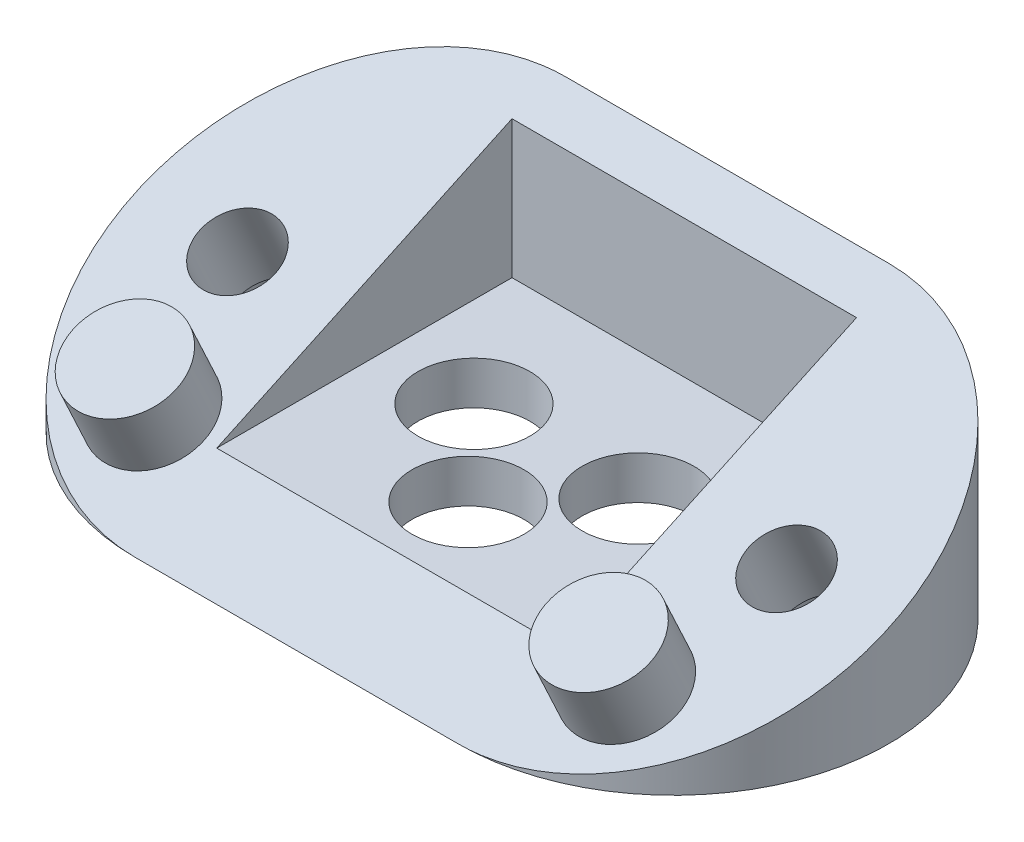
ISO-10303-21;
HEADER;
FILE_DESCRIPTION(('STEP AP214'),'2;1');
FILE_NAME('part.step','',(''),(''),'','','');
FILE_SCHEMA(('AUTOMOTIVE_DESIGN { 1 0 10303 214 1 1 1 1 }'));
ENDSEC;
DATA;
#1=APPLICATION_CONTEXT('core data for automotive mechanical design processes');
#2=APPLICATION_PROTOCOL_DEFINITION('international standard','automotive_design',2000,#1);
#3=PRODUCT_CONTEXT('',#1,'mechanical');
#4=PRODUCT('Part','Part','',(#3));
#5=PRODUCT_RELATED_PRODUCT_CATEGORY('part','',(#4));
#6=PRODUCT_DEFINITION_FORMATION('','',#4);
#7=PRODUCT_DEFINITION_CONTEXT('part definition',#1,'design');
#8=PRODUCT_DEFINITION('design','',#6,#7);
#9=PRODUCT_DEFINITION_SHAPE('','',#8);
#10=(LENGTH_UNIT() NAMED_UNIT(*) SI_UNIT(.MILLI.,.METRE.));
#11=(NAMED_UNIT(*) PLANE_ANGLE_UNIT() SI_UNIT($,.RADIAN.));
#12=(NAMED_UNIT(*) SI_UNIT($,.STERADIAN.) SOLID_ANGLE_UNIT());
#13=UNCERTAINTY_MEASURE_WITH_UNIT(LENGTH_MEASURE(1.E-05),#10,'distance_accuracy_value','');
#14=(GEOMETRIC_REPRESENTATION_CONTEXT(3) GLOBAL_UNCERTAINTY_ASSIGNED_CONTEXT((#13)) GLOBAL_UNIT_ASSIGNED_CONTEXT((#10,
#11,#12)) REPRESENTATION_CONTEXT('',''));
#15=CARTESIAN_POINT('',(0.,0.,0.));
#16=DIRECTION('',(0.,0.,1.));
#17=DIRECTION('',(1.,0.,0.));
#18=AXIS2_PLACEMENT_3D('',#15,#16,#17);
#19=CARTESIAN_POINT('',(-7.5,0.,0.));
#20=DIRECTION('',(0.,1.,0.));
#21=DIRECTION('',(0.,0.,1.));
#22=AXIS2_PLACEMENT_3D('',#19,#20,#21);
#23=PLANE('',#22);
#24=CARTESIAN_POINT('',(0.,0.,2.04286239259701));
#25=DIRECTION('',(0.,1.,0.));
#26=DIRECTION('',(0.,0.,1.));
#27=AXIS2_PLACEMENT_3D('',#24,#25,#26);
#28=CIRCLE('',#27,2.6);
#29=CARTESIAN_POINT('',(0.,0.,4.64286239259701));
#30=VERTEX_POINT('',#29);
#31=EDGE_CURVE('E184',#30,#30,#28,.T.);
#32=ORIENTED_EDGE('',*,*,#31,.T.);
#33=EDGE_LOOP('',(#32));
#34=FACE_BOUND('',#33,.T.);
#35=CARTESIAN_POINT('',(3.80999999999998,0.,-2.04286239259701));
#36=DIRECTION('',(0.,1.,0.));
#37=DIRECTION('',(0.,0.,1.));
#38=AXIS2_PLACEMENT_3D('',#35,#36,#37);
#39=CIRCLE('',#38,2.6);
#40=CARTESIAN_POINT('',(3.80999999999998,0.,0.557137607402988));
#41=VERTEX_POINT('',#40);
#42=EDGE_CURVE('E187',#41,#41,#39,.T.);
#43=ORIENTED_EDGE('',*,*,#42,.T.);
#44=EDGE_LOOP('',(#43));
#45=FACE_BOUND('',#44,.T.);
#46=CARTESIAN_POINT('',(-3.81000000000002,0.,-2.04286239259701));
#47=DIRECTION('',(0.,1.,0.));
#48=DIRECTION('',(0.,0.,1.));
#49=AXIS2_PLACEMENT_3D('',#46,#47,#48);
#50=CIRCLE('',#49,2.6);
#51=CARTESIAN_POINT('',(-3.81000000000002,0.,0.557137607402986));
#52=VERTEX_POINT('',#51);
#53=EDGE_CURVE('E190',#52,#52,#50,.T.);
#54=ORIENTED_EDGE('',*,*,#53,.T.);
#55=EDGE_LOOP('',(#54));
#56=FACE_BOUND('',#55,.T.);
#57=CARTESIAN_POINT('',(-7.5,0.,0.));
#58=DIRECTION('',(0.,1.,0.));
#59=DIRECTION('',(0.,0.,1.));
#60=AXIS2_PLACEMENT_3D('',#57,#58,#59);
#61=CIRCLE('',#60,10.);
#62=CARTESIAN_POINT('',(-7.5,0.,-10.));
#63=VERTEX_POINT('',#62);
#64=CARTESIAN_POINT('',(-7.5,0.,10.));
#65=VERTEX_POINT('',#64);
#66=EDGE_CURVE('E193',#63,#65,#61,.T.);
#67=ORIENTED_EDGE('',*,*,#66,.F.);
#68=DIRECTION('',(-1.,0.,0.));
#69=VECTOR('',#68,1.);
#70=CARTESIAN_POINT('',(-7.5,0.,-10.));
#71=LINE('',#70,#69);
#72=CARTESIAN_POINT('',(7.5,0.,-10.));
#73=VERTEX_POINT('',#72);
#74=EDGE_CURVE('E201',#73,#63,#71,.T.);
#75=ORIENTED_EDGE('',*,*,#74,.F.);
#76=CARTESIAN_POINT('',(7.5,0.,0.));
#77=DIRECTION('',(0.,1.,0.));
#78=DIRECTION('',(0.,0.,1.));
#79=AXIS2_PLACEMENT_3D('',#76,#77,#78);
#80=CIRCLE('',#79,10.);
#81=CARTESIAN_POINT('',(7.5,0.,10.));
#82=VERTEX_POINT('',#81);
#83=EDGE_CURVE('E198',#82,#73,#80,.T.);
#84=ORIENTED_EDGE('',*,*,#83,.F.);
#85=DIRECTION('',(1.,0.,0.));
#86=VECTOR('',#85,1.);
#87=CARTESIAN_POINT('',(-7.5,0.,10.));
#88=LINE('',#87,#86);
#89=EDGE_CURVE('E196',#65,#82,#88,.T.);
#90=ORIENTED_EDGE('',*,*,#89,.F.);
#91=EDGE_LOOP('',(#67,#75,#84,#90));
#92=FACE_BOUND('',#91,.T.);
#93=CARTESIAN_POINT('',(-12.75,0.,-2.17442832054005));
#94=DIRECTION('',(0.,1.,0.));
#95=DIRECTION('',(0.,0.,1.));
#96=AXIS2_PLACEMENT_3D('',#93,#94,#95);
#97=ELLIPSE('',#96,2.75844479740624,2.5);
#98=CARTESIAN_POINT('',(-13.2182782644806,0.,0.535193667390117));
#99=VERTEX_POINT('',#98);
#100=CARTESIAN_POINT('',(-12.2817217355194,0.,0.535193667390117));
#101=VERTEX_POINT('',#100);
#102=EDGE_CURVE('E144',#99,#101,#97,.T.);
#103=ORIENTED_EDGE('',*,*,#102,.T.);
#104=CARTESIAN_POINT('',(-12.75,0.,-2.17442832054005));
#105=DIRECTION('',(0.,1.,0.));
#106=DIRECTION('',(0.,0.,1.));
#107=AXIS2_PLACEMENT_3D('',#104,#105,#106);
#108=ELLIPSE('',#107,2.75844479740624,2.5);
#109=EDGE_CURVE('E247',#99,#101,#108,.F.);
#110=ORIENTED_EDGE('',*,*,#109,.F.);
#111=EDGE_LOOP('',(#103,#110));
#112=FACE_BOUND('',#111,.T.);
#113=CARTESIAN_POINT('',(12.75,0.,-2.17442832054005));
#114=DIRECTION('',(0.,1.,0.));
#115=DIRECTION('',(0.,0.,1.));
#116=AXIS2_PLACEMENT_3D('',#113,#114,#115);
#117=ELLIPSE('',#116,2.75844479740624,2.5);
#118=CARTESIAN_POINT('',(13.2182782644807,0.,0.535193667390115));
#119=VERTEX_POINT('',#118);
#120=CARTESIAN_POINT('',(12.2817217355193,0.,0.535193667390115));
#121=VERTEX_POINT('',#120);
#122=EDGE_CURVE('E124',#119,#121,#117,.T.);
#123=ORIENTED_EDGE('',*,*,#122,.T.);
#124=CARTESIAN_POINT('',(12.75,0.,-2.17442832054005));
#125=DIRECTION('',(0.,1.,0.));
#126=DIRECTION('',(0.,0.,1.));
#127=AXIS2_PLACEMENT_3D('',#124,#125,#126);
#128=ELLIPSE('',#127,2.75844479740624,2.5);
#129=EDGE_CURVE('E133',#121,#119,#128,.T.);
#130=ORIENTED_EDGE('',*,*,#129,.T.);
#131=EDGE_LOOP('',(#123,#130));
#132=FACE_BOUND('',#131,.T.);
#133=ADVANCED_FACE('F56',(#34,#45,#56,#92,#112,#132),#23,.F.);
#134=CARTESIAN_POINT('',(12.75,-2.9973678496398,-3.57212390313469));
#135=DIRECTION('',(0.,0.906307787036648,0.422618261740704));
#136=DIRECTION('',(0.,-0.422618261740704,0.906307787036648));
#137=AXIS2_PLACEMENT_3D('',#134,#135,#136);
#138=CYLINDRICAL_SURFACE('',#137,1.75);
#139=CARTESIAN_POINT('',(12.75,4.66307658155005,0.));
#140=DIRECTION('',(0.,-0.906307787036648,-0.422618261740704));
#141=DIRECTION('',(0.,0.422618261740704,-0.906307787036648));
#142=AXIS2_PLACEMENT_3D('',#139,#140,#141);
#143=CIRCLE('',#142,1.75);
#144=CARTESIAN_POINT('',(12.75,5.40265853959628,-1.58603862731413));
#145=VERTEX_POINT('',#144);
#146=EDGE_CURVE('E150',#145,#145,#143,.T.);
#147=ORIENTED_EDGE('',*,*,#146,.F.);
#148=EDGE_LOOP('',(#147));
#149=FACE_BOUND('',#148,.T.);
#150=CARTESIAN_POINT('',(12.75,1.03784543340346,-1.69047304696282));
#151=DIRECTION('',(0.,0.906307787036648,0.422618261740704));
#152=DIRECTION('',(0.,-0.422618261740704,0.906307787036648));
#153=AXIS2_PLACEMENT_3D('',#150,#151,#152);
#154=CIRCLE('',#153,1.75);
#155=CARTESIAN_POINT('',(12.75,0.298263475357228,-0.104434419648684));
#156=VERTEX_POINT('',#155);
#157=EDGE_CURVE('E128',#156,#156,#154,.T.);
#158=ORIENTED_EDGE('',*,*,#157,.F.);
#159=EDGE_LOOP('',(#158));
#160=FACE_BOUND('',#159,.T.);
#161=ADVANCED_FACE('F233',(#149,#160),#138,.F.);
#162=CARTESIAN_POINT('',(-3.81000000000002,20.,-2.04286239259701));
#163=DIRECTION('',(0.,-1.,0.));
#164=DIRECTION('',(0.,0.,-1.));
#165=AXIS2_PLACEMENT_3D('',#162,#163,#164);
#166=CYLINDRICAL_SURFACE('',#165,2.6);
#167=ORIENTED_EDGE('',*,*,#53,.F.);
#168=EDGE_LOOP('',(#167));
#169=FACE_BOUND('',#168,.T.);
#170=CARTESIAN_POINT('',(-3.81000000000002,2.,-2.04286239259701));
#171=DIRECTION('',(0.,1.,0.));
#172=DIRECTION('',(0.,0.,1.));
#173=AXIS2_PLACEMENT_3D('',#170,#171,#172);
#174=CIRCLE('',#173,2.6);
#175=CARTESIAN_POINT('',(-3.81000000000002,2.,0.557137607402986));
#176=VERTEX_POINT('',#175);
#177=EDGE_CURVE('E181',#176,#176,#174,.T.);
#178=ORIENTED_EDGE('',*,*,#177,.T.);
#179=EDGE_LOOP('',(#178));
#180=FACE_BOUND('',#179,.T.);
#181=ADVANCED_FACE('F236',(#169,#180),#166,.F.);
#182=CARTESIAN_POINT('',(3.80999999999998,20.,-2.04286239259701));
#183=DIRECTION('',(0.,-1.,0.));
#184=DIRECTION('',(0.,0.,-1.));
#185=AXIS2_PLACEMENT_3D('',#182,#183,#184);
#186=CYLINDRICAL_SURFACE('',#185,2.6);
#187=ORIENTED_EDGE('',*,*,#42,.F.);
#188=EDGE_LOOP('',(#187));
#189=FACE_BOUND('',#188,.T.);
#190=CARTESIAN_POINT('',(3.80999999999998,2.,-2.04286239259701));
#191=DIRECTION('',(0.,1.,0.));
#192=DIRECTION('',(0.,0.,1.));
#193=AXIS2_PLACEMENT_3D('',#190,#191,#192);
#194=CIRCLE('',#193,2.6);
#195=CARTESIAN_POINT('',(3.80999999999998,2.,0.557137607402988));
#196=VERTEX_POINT('',#195);
#197=EDGE_CURVE('E178',#196,#196,#194,.T.);
#198=ORIENTED_EDGE('',*,*,#197,.T.);
#199=EDGE_LOOP('',(#198));
#200=FACE_BOUND('',#199,.T.);
#201=ADVANCED_FACE('F345',(#189,#200),#186,.F.);
#202=CARTESIAN_POINT('',(0.,20.,2.04286239259701));
#203=DIRECTION('',(0.,-1.,0.));
#204=DIRECTION('',(0.,0.,-1.));
#205=AXIS2_PLACEMENT_3D('',#202,#203,#204);
#206=CYLINDRICAL_SURFACE('',#205,2.6);
#207=ORIENTED_EDGE('',*,*,#31,.F.);
#208=EDGE_LOOP('',(#207));
#209=FACE_BOUND('',#208,.T.);
#210=CARTESIAN_POINT('',(0.,2.,2.04286239259701));
#211=DIRECTION('',(0.,1.,0.));
#212=DIRECTION('',(0.,0.,1.));
#213=AXIS2_PLACEMENT_3D('',#210,#211,#212);
#214=CIRCLE('',#213,2.6);
#215=CARTESIAN_POINT('',(0.,2.,4.64286239259701));
#216=VERTEX_POINT('',#215);
#217=EDGE_CURVE('E177',#216,#216,#214,.T.);
#218=ORIENTED_EDGE('',*,*,#217,.T.);
#219=EDGE_LOOP('',(#218));
#220=FACE_BOUND('',#219,.T.);
#221=ADVANCED_FACE('F294',(#209,#220),#206,.F.);
#222=CARTESIAN_POINT('',(-7.5,20.,0.));
#223=DIRECTION('',(0.,-1.,0.));
#224=DIRECTION('',(0.,0.,-1.));
#225=AXIS2_PLACEMENT_3D('',#222,#223,#224);
#226=CYLINDRICAL_SURFACE('',#225,10.);
#227=ORIENTED_EDGE('',*,*,#66,.T.);
#228=CARTESIAN_POINT('',(-7.5,4.66307658155005,0.));
#229=DIRECTION('',(0.,-0.906307787036648,-0.422618261740704));
#230=DIRECTION('',(0.,-0.422618261740704,0.906307787036648));
#231=AXIS2_PLACEMENT_3D('',#228,#229,#230);
#232=ELLIPSE('',#231,11.0337791896249,10.);
#233=CARTESIAN_POINT('',(-7.5,9.3261531631001,-10.));
#234=VERTEX_POINT('',#233);
#235=EDGE_CURVE('E162',#65,#234,#232,.T.);
#236=ORIENTED_EDGE('',*,*,#235,.T.);
#237=DIRECTION('',(0.,-1.,0.));
#238=VECTOR('',#237,1.);
#239=CARTESIAN_POINT('',(-7.5,20.,-10.));
#240=LINE('',#239,#238);
#241=EDGE_CURVE('E204',#234,#63,#240,.T.);
#242=ORIENTED_EDGE('',*,*,#241,.T.);
#243=EDGE_LOOP('',(#227,#236,#242));
#244=FACE_BOUND('',#243,.T.);
#245=ADVANCED_FACE('F58',(#244),#226,.T.);
#246=CARTESIAN_POINT('',(7.5,20.,0.));
#247=DIRECTION('',(0.,-1.,0.));
#248=DIRECTION('',(0.,0.,-1.));
#249=AXIS2_PLACEMENT_3D('',#246,#247,#248);
#250=CYLINDRICAL_SURFACE('',#249,10.);
#251=DIRECTION('',(0.,-1.,0.));
#252=VECTOR('',#251,1.);
#253=CARTESIAN_POINT('',(7.5,20.,-10.));
#254=LINE('',#253,#252);
#255=CARTESIAN_POINT('',(7.5,9.3261531631001,-10.));
#256=VERTEX_POINT('',#255);
#257=EDGE_CURVE('E206',#256,#73,#254,.T.);
#258=ORIENTED_EDGE('',*,*,#257,.F.);
#259=CARTESIAN_POINT('',(7.5,4.66307658155005,0.));
#260=DIRECTION('',(0.,-0.906307787036648,-0.422618261740704));
#261=DIRECTION('',(0.,-0.422618261740704,0.906307787036648));
#262=AXIS2_PLACEMENT_3D('',#259,#260,#261);
#263=ELLIPSE('',#262,11.0337791896249,10.);
#264=EDGE_CURVE('E71',#256,#82,#263,.T.);
#265=ORIENTED_EDGE('',*,*,#264,.T.);
#266=ORIENTED_EDGE('',*,*,#83,.T.);
#267=EDGE_LOOP('',(#258,#265,#266));
#268=FACE_BOUND('',#267,.T.);
#269=ADVANCED_FACE('F287',(#268),#250,.T.);
#270=CARTESIAN_POINT('',(-7.5,20.,-10.));
#271=DIRECTION('',(0.,0.,1.));
#272=DIRECTION('',(1.,0.,0.));
#273=AXIS2_PLACEMENT_3D('',#270,#271,#272);
#274=PLANE('',#273);
#275=ORIENTED_EDGE('',*,*,#241,.F.);
#276=DIRECTION('',(1.,0.,0.));
#277=VECTOR('',#276,1.);
#278=CARTESIAN_POINT('',(-17.5,9.3261531631001,-10.));
#279=LINE('',#278,#277);
#280=EDGE_CURVE('E151',#234,#256,#279,.T.);
#281=ORIENTED_EDGE('',*,*,#280,.T.);
#282=ORIENTED_EDGE('',*,*,#257,.T.);
#283=ORIENTED_EDGE('',*,*,#74,.T.);
#284=EDGE_LOOP('',(#275,#281,#282,#283));
#285=FACE_BOUND('',#284,.T.);
#286=ADVANCED_FACE('F284',(#285),#274,.F.);
#287=CARTESIAN_POINT('',(8.,-22.6274169979695,-8.));
#288=DIRECTION('',(1.,0.,0.));
#289=DIRECTION('',(0.,0.,-1.));
#290=AXIS2_PLACEMENT_3D('',#287,#288,#289);
#291=PLANE('',#290);
#292=DIRECTION('',(0.,0.,1.));
#293=VECTOR('',#292,1.);
#294=CARTESIAN_POINT('',(8.,2.,-8.));
#295=LINE('',#294,#293);
#296=CARTESIAN_POINT('',(8.,2.,-8.));
#297=VERTEX_POINT('',#296);
#298=CARTESIAN_POINT('',(8.,2.,5.71098615898094));
#299=VERTEX_POINT('',#298);
#300=EDGE_CURVE('E167',#297,#299,#295,.T.);
#301=ORIENTED_EDGE('',*,*,#300,.T.);
#302=DIRECTION('',(0.,0.422618261740704,-0.906307787036648));
#303=VECTOR('',#302,1.);
#304=CARTESIAN_POINT('',(8.,2.85300313183871,3.88171503953652));
#305=LINE('',#304,#303);
#306=CARTESIAN_POINT('',(8.,8.39353784679009,-8.));
#307=VERTEX_POINT('',#306);
#308=EDGE_CURVE('E79',#299,#307,#305,.T.);
#309=ORIENTED_EDGE('',*,*,#308,.T.);
#310=DIRECTION('',(0.,1.,0.));
#311=VECTOR('',#310,1.);
#312=CARTESIAN_POINT('',(8.,-22.6274169979695,-8.));
#313=LINE('',#312,#311);
#314=EDGE_CURVE('E164',#297,#307,#313,.T.);
#315=ORIENTED_EDGE('',*,*,#314,.F.);
#316=EDGE_LOOP('',(#301,#309,#315));
#317=FACE_BOUND('',#316,.T.);
#318=ADVANCED_FACE('F286',(#317),#291,.F.);
#319=CARTESIAN_POINT('',(-8.,-22.6274169979695,-8.));
#320=DIRECTION('',(-1.,0.,0.));
#321=DIRECTION('',(0.,0.,1.));
#322=AXIS2_PLACEMENT_3D('',#319,#320,#321);
#323=PLANE('',#322);
#324=DIRECTION('',(0.,1.,0.));
#325=VECTOR('',#324,1.);
#326=CARTESIAN_POINT('',(-8.,-22.6274169979695,-8.));
#327=LINE('',#326,#325);
#328=CARTESIAN_POINT('',(-8.,2.,-8.));
#329=VERTEX_POINT('',#328);
#330=CARTESIAN_POINT('',(-8.,8.39353784679009,-8.));
#331=VERTEX_POINT('',#330);
#332=EDGE_CURVE('E168',#329,#331,#327,.T.);
#333=ORIENTED_EDGE('',*,*,#332,.T.);
#334=DIRECTION('',(0.,-0.422618261740704,0.906307787036648));
#335=VECTOR('',#334,1.);
#336=CARTESIAN_POINT('',(-8.,2.85300313183871,3.88171503953652));
#337=LINE('',#336,#335);
#338=CARTESIAN_POINT('',(-8.,2.,5.71098615898094));
#339=VERTEX_POINT('',#338);
#340=EDGE_CURVE('E153',#331,#339,#337,.T.);
#341=ORIENTED_EDGE('',*,*,#340,.T.);
#342=DIRECTION('',(0.,0.,-1.));
#343=VECTOR('',#342,1.);
#344=CARTESIAN_POINT('',(-8.,2.,-8.));
#345=LINE('',#344,#343);
#346=EDGE_CURVE('E165',#339,#329,#345,.T.);
#347=ORIENTED_EDGE('',*,*,#346,.T.);
#348=EDGE_LOOP('',(#333,#341,#347));
#349=FACE_BOUND('',#348,.T.);
#350=ADVANCED_FACE('F334',(#349),#323,.F.);
#351=CARTESIAN_POINT('',(-8.,-22.6274169979695,-8.));
#352=DIRECTION('',(0.,0.,-1.));
#353=DIRECTION('',(-1.,0.,0.));
#354=AXIS2_PLACEMENT_3D('',#351,#352,#353);
#355=PLANE('',#354);
#356=ORIENTED_EDGE('',*,*,#314,.T.);
#357=DIRECTION('',(-1.,0.,0.));
#358=VECTOR('',#357,1.);
#359=CARTESIAN_POINT('',(-8.,8.39353784679009,-8.));
#360=LINE('',#359,#358);
#361=EDGE_CURVE('E158',#307,#331,#360,.T.);
#362=ORIENTED_EDGE('',*,*,#361,.T.);
#363=ORIENTED_EDGE('',*,*,#332,.F.);
#364=DIRECTION('',(1.,0.,0.));
#365=VECTOR('',#364,1.);
#366=CARTESIAN_POINT('',(-8.,2.,-8.));
#367=LINE('',#366,#365);
#368=EDGE_CURVE('E171',#329,#297,#367,.T.);
#369=ORIENTED_EDGE('',*,*,#368,.T.);
#370=EDGE_LOOP('',(#356,#362,#363,#369));
#371=FACE_BOUND('',#370,.T.);
#372=ADVANCED_FACE('F332',(#371),#355,.F.);
#373=CARTESIAN_POINT('',(-7.5,2.,0.));
#374=DIRECTION('',(0.,1.,0.));
#375=DIRECTION('',(0.,0.,1.));
#376=AXIS2_PLACEMENT_3D('',#373,#374,#375);
#377=PLANE('',#376);
#378=DIRECTION('',(-1.,0.,0.));
#379=VECTOR('',#378,1.);
#380=CARTESIAN_POINT('',(-7.5,2.,5.71098615898094));
#381=LINE('',#380,#379);
#382=EDGE_CURVE('E208',#299,#339,#381,.T.);
#383=ORIENTED_EDGE('',*,*,#382,.F.);
#384=ORIENTED_EDGE('',*,*,#300,.F.);
#385=ORIENTED_EDGE('',*,*,#368,.F.);
#386=ORIENTED_EDGE('',*,*,#346,.F.);
#387=EDGE_LOOP('',(#383,#384,#385,#386));
#388=FACE_BOUND('',#387,.T.);
#389=ORIENTED_EDGE('',*,*,#177,.F.);
#390=EDGE_LOOP('',(#389));
#391=FACE_BOUND('',#390,.T.);
#392=ORIENTED_EDGE('',*,*,#197,.F.);
#393=EDGE_LOOP('',(#392));
#394=FACE_BOUND('',#393,.T.);
#395=ORIENTED_EDGE('',*,*,#217,.F.);
#396=EDGE_LOOP('',(#395));
#397=FACE_BOUND('',#396,.T.);
#398=ADVANCED_FACE('F223',(#388,#391,#394,#397),#377,.T.);
#399=CARTESIAN_POINT('',(-17.5,3.83022221559492,1.78606195156734));
#400=DIRECTION('',(0.,-0.906307787036648,-0.422618261740704));
#401=DIRECTION('',(0.,0.422618261740704,-0.906307787036648));
#402=AXIS2_PLACEMENT_3D('',#399,#400,#401);
#403=PLANE('',#402);
#404=CARTESIAN_POINT('',(11.,2.,5.71098615898094));
#405=DIRECTION('',(0.,-0.906307787036648,-0.422618261740704));
#406=DIRECTION('',(0.,0.422618261740704,-0.906307787036648));
#407=AXIS2_PLACEMENT_3D('',#404,#405,#406);
#408=CIRCLE('',#407,2.4);
#409=CARTESIAN_POINT('',(11.,3.01428382817769,3.53584747009299));
#410=VERTEX_POINT('',#409);
#411=EDGE_CURVE('E13',#410,#410,#408,.F.);
#412=ORIENTED_EDGE('',*,*,#411,.F.);
#413=EDGE_LOOP('',(#412));
#414=FACE_BOUND('',#413,.T.);
#415=CARTESIAN_POINT('',(-11.,2.,5.71098615898094));
#416=DIRECTION('',(0.,-0.906307787036648,-0.422618261740704));
#417=DIRECTION('',(0.,0.422618261740704,-0.906307787036648));
#418=AXIS2_PLACEMENT_3D('',#415,#416,#417);
#419=CIRCLE('',#418,2.4);
#420=CARTESIAN_POINT('',(-11.,3.01428382817769,3.53584747009299));
#421=VERTEX_POINT('',#420);
#422=EDGE_CURVE('E64',#421,#421,#419,.F.);
#423=ORIENTED_EDGE('',*,*,#422,.F.);
#424=EDGE_LOOP('',(#423));
#425=FACE_BOUND('',#424,.T.);
#426=ORIENTED_EDGE('',*,*,#308,.F.);
#427=ORIENTED_EDGE('',*,*,#382,.T.);
#428=ORIENTED_EDGE('',*,*,#340,.F.);
#429=ORIENTED_EDGE('',*,*,#361,.F.);
#430=EDGE_LOOP('',(#426,#427,#428,#429));
#431=FACE_BOUND('',#430,.T.);
#432=ORIENTED_EDGE('',*,*,#89,.T.);
#433=ORIENTED_EDGE('',*,*,#264,.F.);
#434=ORIENTED_EDGE('',*,*,#280,.F.);
#435=ORIENTED_EDGE('',*,*,#235,.F.);
#436=EDGE_LOOP('',(#432,#433,#434,#435));
#437=FACE_BOUND('',#436,.T.);
#438=CARTESIAN_POINT('',(-12.75,4.66307658155005,0.));
#439=DIRECTION('',(0.,-0.906307787036648,-0.422618261740704));
#440=DIRECTION('',(0.,0.422618261740704,-0.906307787036648));
#441=AXIS2_PLACEMENT_3D('',#438,#439,#440);
#442=CIRCLE('',#441,1.75);
#443=CARTESIAN_POINT('',(-12.75,5.40265853959628,-1.58603862731413));
#444=VERTEX_POINT('',#443);
#445=EDGE_CURVE('E154',#444,#444,#442,.T.);
#446=ORIENTED_EDGE('',*,*,#445,.T.);
#447=EDGE_LOOP('',(#446));
#448=FACE_BOUND('',#447,.T.);
#449=ORIENTED_EDGE('',*,*,#146,.T.);
#450=EDGE_LOOP('',(#449));
#451=FACE_BOUND('',#450,.T.);
#452=ADVANCED_FACE('F220',(#414,#425,#431,#437,#448,#451),#403,.F.);
#453=CARTESIAN_POINT('',(-12.75,-2.9973678496398,-3.57212390313469));
#454=DIRECTION('',(0.,0.906307787036648,0.422618261740704));
#455=DIRECTION('',(0.,-0.422618261740704,0.906307787036648));
#456=AXIS2_PLACEMENT_3D('',#453,#454,#455);
#457=CYLINDRICAL_SURFACE('',#456,1.75);
#458=CARTESIAN_POINT('',(-12.75,1.03784543340346,-1.69047304696282));
#459=DIRECTION('',(0.,0.906307787036648,0.422618261740704));
#460=DIRECTION('',(0.,-0.422618261740704,0.906307787036648));
#461=AXIS2_PLACEMENT_3D('',#458,#459,#460);
#462=CIRCLE('',#461,1.75);
#463=CARTESIAN_POINT('',(-12.75,0.298263475357228,-0.104434419648682));
#464=VERTEX_POINT('',#463);
#465=EDGE_CURVE('E240',#464,#464,#462,.T.);
#466=ORIENTED_EDGE('',*,*,#465,.F.);
#467=EDGE_LOOP('',(#466));
#468=FACE_BOUND('',#467,.T.);
#469=ORIENTED_EDGE('',*,*,#445,.F.);
#470=EDGE_LOOP('',(#469));
#471=FACE_BOUND('',#470,.T.);
#472=ADVANCED_FACE('F222',(#468,#471),#457,.F.);
#473=CARTESIAN_POINT('',(-12.75,1.03784543340346,-1.69047304696282));
#474=DIRECTION('',(0.,0.906307787036648,0.422618261740704));
#475=DIRECTION('',(0.,-0.422618261740704,0.906307787036648));
#476=AXIS2_PLACEMENT_3D('',#473,#474,#475);
#477=CYLINDRICAL_SURFACE('',#476,2.5);
#478=ORIENTED_EDGE('',*,*,#102,.F.);
#479=CARTESIAN_POINT('',(-12.75,1.03784543340346,-1.69047304696282));
#480=DIRECTION('',(0.,0.906307787036648,0.422618261740704));
#481=DIRECTION('',(0.,-0.422618261740704,0.906307787036648));
#482=AXIS2_PLACEMENT_3D('',#479,#480,#481);
#483=CIRCLE('',#482,2.5);
#484=EDGE_CURVE('E141',#99,#101,#483,.T.);
#485=ORIENTED_EDGE('',*,*,#484,.T.);
#486=EDGE_LOOP('',(#478,#485));
#487=FACE_BOUND('',#486,.T.);
#488=ADVANCED_FACE('F305',(#487),#477,.T.);
#489=CARTESIAN_POINT('',(-12.75,1.03784543340346,-1.69047304696282));
#490=DIRECTION('',(0.,0.906307787036648,0.422618261740704));
#491=DIRECTION('',(0.,-0.422618261740704,0.906307787036648));
#492=AXIS2_PLACEMENT_3D('',#489,#490,#491);
#493=PLANE('',#492);
#494=ORIENTED_EDGE('',*,*,#484,.F.);
#495=CARTESIAN_POINT('',(-12.75,1.03784543340346,-1.69047304696282));
#496=DIRECTION('',(0.,0.906307787036648,0.422618261740704));
#497=DIRECTION('',(0.,-0.422618261740704,0.906307787036648));
#498=AXIS2_PLACEMENT_3D('',#495,#496,#497);
#499=CIRCLE('',#498,2.5);
#500=EDGE_CURVE('E243',#101,#99,#499,.T.);
#501=ORIENTED_EDGE('',*,*,#500,.F.);
#502=EDGE_LOOP('',(#494,#501));
#503=FACE_BOUND('',#502,.T.);
#504=ORIENTED_EDGE('',*,*,#465,.T.);
#505=EDGE_LOOP('',(#504));
#506=FACE_BOUND('',#505,.T.);
#507=ADVANCED_FACE('F307',(#503,#506),#493,.F.);
#508=CARTESIAN_POINT('',(12.75,1.03784543340346,-1.69047304696282));
#509=DIRECTION('',(0.,0.906307787036648,0.422618261740704));
#510=DIRECTION('',(0.,-0.422618261740704,0.906307787036648));
#511=AXIS2_PLACEMENT_3D('',#508,#509,#510);
#512=CYLINDRICAL_SURFACE('',#511,2.5);
#513=ORIENTED_EDGE('',*,*,#129,.F.);
#514=CARTESIAN_POINT('',(12.75,1.03784543340346,-1.69047304696282));
#515=DIRECTION('',(0.,0.906307787036648,0.422618261740704));
#516=DIRECTION('',(0.,0.422618261740704,-0.906307787036648));
#517=AXIS2_PLACEMENT_3D('',#514,#515,#516);
#518=CIRCLE('',#517,2.5);
#519=EDGE_CURVE('E134',#121,#119,#518,.T.);
#520=ORIENTED_EDGE('',*,*,#519,.T.);
#521=EDGE_LOOP('',(#513,#520));
#522=FACE_BOUND('',#521,.T.);
#523=ADVANCED_FACE('F140',(#522),#512,.T.);
#524=CARTESIAN_POINT('',(12.75,1.03784543340346,-1.69047304696282));
#525=DIRECTION('',(0.,-0.906307787036648,-0.422618261740704));
#526=DIRECTION('',(0.,0.422618261740704,-0.906307787036648));
#527=AXIS2_PLACEMENT_3D('',#524,#525,#526);
#528=PLANE('',#527);
#529=ORIENTED_EDGE('',*,*,#519,.F.);
#530=CARTESIAN_POINT('',(12.75,1.03784543340346,-1.69047304696282));
#531=DIRECTION('',(0.,-0.906307787036648,-0.422618261740704));
#532=DIRECTION('',(0.,0.422618261740704,-0.906307787036648));
#533=AXIS2_PLACEMENT_3D('',#530,#531,#532);
#534=CIRCLE('',#533,2.5);
#535=EDGE_CURVE('E121',#121,#119,#534,.T.);
#536=ORIENTED_EDGE('',*,*,#535,.T.);
#537=EDGE_LOOP('',(#529,#536));
#538=FACE_BOUND('',#537,.T.);
#539=ORIENTED_EDGE('',*,*,#157,.T.);
#540=EDGE_LOOP('',(#539));
#541=FACE_BOUND('',#540,.T.);
#542=ADVANCED_FACE('F136',(#538,#541),#528,.T.);
#543=CARTESIAN_POINT('',(12.75,-6.73981581621168,-5.31725605019378));
#544=DIRECTION('',(0.,0.906307787036648,0.422618261740704));
#545=DIRECTION('',(0.,-0.422618261740704,0.906307787036648));
#546=AXIS2_PLACEMENT_3D('',#543,#544,#545);
#547=CYLINDRICAL_SURFACE('',#546,2.5);
#548=ORIENTED_EDGE('',*,*,#535,.F.);
#549=ORIENTED_EDGE('',*,*,#122,.F.);
#550=EDGE_LOOP('',(#548,#549));
#551=FACE_BOUND('',#550,.T.);
#552=ADVANCED_FACE('F123',(#551),#547,.F.);
#553=CARTESIAN_POINT('',(-12.75,-6.73981581621167,-5.31725605019378));
#554=DIRECTION('',(0.,0.906307787036648,0.422618261740704));
#555=DIRECTION('',(0.,-0.422618261740704,0.906307787036648));
#556=AXIS2_PLACEMENT_3D('',#553,#554,#555);
#557=CYLINDRICAL_SURFACE('',#556,2.5);
#558=ORIENTED_EDGE('',*,*,#109,.T.);
#559=ORIENTED_EDGE('',*,*,#500,.T.);
#560=EDGE_LOOP('',(#558,#559));
#561=FACE_BOUND('',#560,.T.);
#562=ADVANCED_FACE('F309',(#561),#557,.F.);
#563=CARTESIAN_POINT('',(-11.,4.71892336110995,6.97884094420306));
#564=DIRECTION('',(0.,-0.906307787036648,-0.422618261740704));
#565=DIRECTION('',(0.,0.422618261740704,-0.906307787036648));
#566=AXIS2_PLACEMENT_3D('',#563,#564,#565);
#567=CYLINDRICAL_SURFACE('',#566,2.4);
#568=CARTESIAN_POINT('',(-11.,4.71892336110995,6.97884094420306));
#569=DIRECTION('',(0.,0.906307787036648,0.422618261740704));
#570=DIRECTION('',(0.,-0.422618261740704,0.906307787036648));
#571=AXIS2_PLACEMENT_3D('',#568,#569,#570);
#572=CIRCLE('',#571,2.4);
#573=CARTESIAN_POINT('',(-11.,3.70463953293226,9.15397963309101));
#574=VERTEX_POINT('',#573);
#575=EDGE_CURVE('E249',#574,#574,#572,.T.);
#576=ORIENTED_EDGE('',*,*,#575,.F.);
#577=EDGE_LOOP('',(#576));
#578=FACE_BOUND('',#577,.T.);
#579=ORIENTED_EDGE('',*,*,#422,.T.);
#580=EDGE_LOOP('',(#579));
#581=FACE_BOUND('',#580,.T.);
#582=ADVANCED_FACE('F218',(#578,#581),#567,.T.);
#583=CARTESIAN_POINT('',(-11.,4.71892336110995,6.97884094420306));
#584=DIRECTION('',(0.,0.906307787036648,0.422618261740704));
#585=DIRECTION('',(0.,-0.422618261740704,0.906307787036648));
#586=AXIS2_PLACEMENT_3D('',#583,#584,#585);
#587=PLANE('',#586);
#588=ORIENTED_EDGE('',*,*,#575,.T.);
#589=EDGE_LOOP('',(#588));
#590=FACE_BOUND('',#589,.T.);
#591=ADVANCED_FACE('F265',(#590),#587,.T.);
#592=CARTESIAN_POINT('',(11.,4.71892336110995,6.97884094420306));
#593=DIRECTION('',(0.,-0.906307787036648,-0.422618261740704));
#594=DIRECTION('',(0.,0.422618261740704,-0.906307787036648));
#595=AXIS2_PLACEMENT_3D('',#592,#593,#594);
#596=CYLINDRICAL_SURFACE('',#595,2.4);
#597=CARTESIAN_POINT('',(11.,4.71892336110995,6.97884094420306));
#598=DIRECTION('',(0.,0.906307787036648,0.422618261740704));
#599=DIRECTION('',(0.,0.422618261740704,-0.906307787036648));
#600=AXIS2_PLACEMENT_3D('',#597,#598,#599);
#601=CIRCLE('',#600,2.4);
#602=CARTESIAN_POINT('',(11.,5.73320718928764,4.8037022553151));
#603=VERTEX_POINT('',#602);
#604=EDGE_CURVE('E253',#603,#603,#601,.T.);
#605=ORIENTED_EDGE('',*,*,#604,.F.);
#606=EDGE_LOOP('',(#605));
#607=FACE_BOUND('',#606,.T.);
#608=ORIENTED_EDGE('',*,*,#411,.T.);
#609=EDGE_LOOP('',(#608));
#610=FACE_BOUND('',#609,.T.);
#611=ADVANCED_FACE('F262',(#607,#610),#596,.T.);
#612=CARTESIAN_POINT('',(11.,4.71892336110995,6.97884094420306));
#613=DIRECTION('',(0.,-0.906307787036648,-0.422618261740704));
#614=DIRECTION('',(0.,0.422618261740704,-0.906307787036648));
#615=AXIS2_PLACEMENT_3D('',#612,#613,#614);
#616=PLANE('',#615);
#617=ORIENTED_EDGE('',*,*,#604,.T.);
#618=EDGE_LOOP('',(#617));
#619=FACE_BOUND('',#618,.T.);
#620=ADVANCED_FACE('F260',(#619),#616,.F.);
#621=CLOSED_SHELL('',(#133,#161,#181,#201,#221,#245,#269,#286,#318,#350,#372,#398,#452,#472,
#488,#507,#523,#542,#552,#562,#582,#591,#611,#620));
#622=MANIFOLD_SOLID_BREP('B2',#621);
#623=ADVANCED_BREP_SHAPE_REPRESENTATION('',(#18,#622),#14);
#624=SHAPE_DEFINITION_REPRESENTATION(#9,#623);
ENDSEC;
END-ISO-10303-21;
